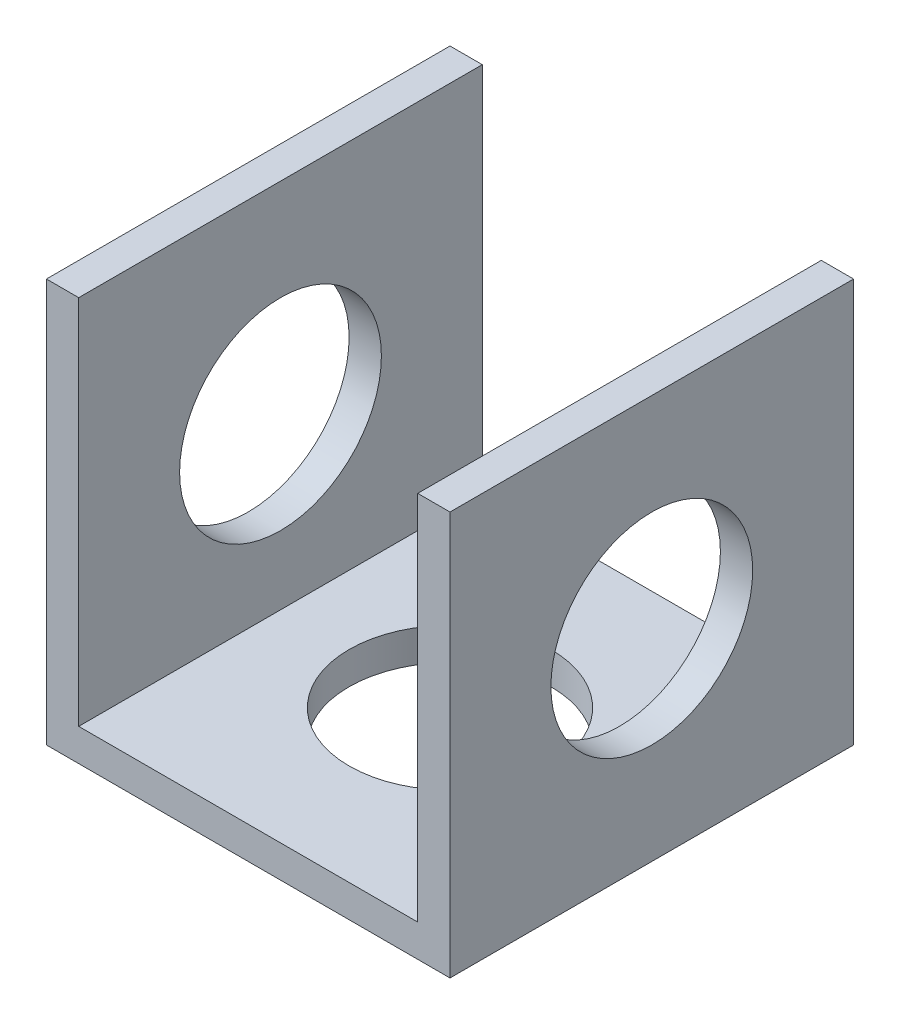
ISO-10303-21;
HEADER;
FILE_DESCRIPTION(('STEP AP214'),'2;1');
FILE_NAME('part.step','',(''),(''),'','','');
FILE_SCHEMA(('AUTOMOTIVE_DESIGN { 1 0 10303 214 1 1 1 1 }'));
ENDSEC;
DATA;
#1=APPLICATION_CONTEXT('core data for automotive mechanical design processes');
#2=APPLICATION_PROTOCOL_DEFINITION('international standard','automotive_design',2000,#1);
#3=PRODUCT_CONTEXT('',#1,'mechanical');
#4=PRODUCT('Part','Part','',(#3));
#5=PRODUCT_RELATED_PRODUCT_CATEGORY('part','',(#4));
#6=PRODUCT_DEFINITION_FORMATION('','',#4);
#7=PRODUCT_DEFINITION_CONTEXT('part definition',#1,'design');
#8=PRODUCT_DEFINITION('design','',#6,#7);
#9=PRODUCT_DEFINITION_SHAPE('','',#8);
#10=(LENGTH_UNIT() NAMED_UNIT(*) SI_UNIT(.MILLI.,.METRE.));
#11=(NAMED_UNIT(*) PLANE_ANGLE_UNIT() SI_UNIT($,.RADIAN.));
#12=(NAMED_UNIT(*) SI_UNIT($,.STERADIAN.) SOLID_ANGLE_UNIT());
#13=UNCERTAINTY_MEASURE_WITH_UNIT(LENGTH_MEASURE(1.E-05),#10,'distance_accuracy_value','');
#14=(GEOMETRIC_REPRESENTATION_CONTEXT(3) GLOBAL_UNCERTAINTY_ASSIGNED_CONTEXT((#13)) GLOBAL_UNIT_ASSIGNED_CONTEXT((#10,
#11,#12)) REPRESENTATION_CONTEXT('',''));
#15=CARTESIAN_POINT('',(0.,0.,0.));
#16=DIRECTION('',(0.,0.,1.));
#17=DIRECTION('',(1.,0.,0.));
#18=AXIS2_PLACEMENT_3D('',#15,#16,#17);
#19=CARTESIAN_POINT('',(6.35,6.35,0.));
#20=DIRECTION('',(0.,-1.,0.));
#21=DIRECTION('',(0.,0.,-1.));
#22=AXIS2_PLACEMENT_3D('',#19,#20,#21);
#23=PLANE('',#22);
#24=DIRECTION('',(-1.,0.,0.));
#25=VECTOR('',#24,1.);
#26=CARTESIAN_POINT('',(6.35,6.35,-6.35));
#27=LINE('',#26,#25);
#28=CARTESIAN_POINT('',(6.35,6.35,-6.35));
#29=VERTEX_POINT('',#28);
#30=CARTESIAN_POINT('',(5.842,6.35,-6.35));
#31=VERTEX_POINT('',#30);
#32=EDGE_CURVE('E171',#29,#31,#27,.T.);
#33=ORIENTED_EDGE('',*,*,#32,.T.);
#34=DIRECTION('',(0.,0.,-1.));
#35=VECTOR('',#34,1.);
#36=CARTESIAN_POINT('',(5.842,6.35,0.));
#37=LINE('',#36,#35);
#38=CARTESIAN_POINT('',(5.842,6.35,0.));
#39=VERTEX_POINT('',#38);
#40=EDGE_CURVE('E142',#39,#31,#37,.T.);
#41=ORIENTED_EDGE('',*,*,#40,.F.);
#42=DIRECTION('',(-1.,0.,0.));
#43=VECTOR('',#42,1.);
#44=CARTESIAN_POINT('',(6.35,6.35,0.));
#45=LINE('',#44,#43);
#46=CARTESIAN_POINT('',(6.35,6.35,0.));
#47=VERTEX_POINT('',#46);
#48=EDGE_CURVE('E131',#47,#39,#45,.T.);
#49=ORIENTED_EDGE('',*,*,#48,.F.);
#50=DIRECTION('',(0.,0.,1.));
#51=VECTOR('',#50,1.);
#52=CARTESIAN_POINT('',(6.35,6.35,0.));
#53=LINE('',#52,#51);
#54=EDGE_CURVE('E59',#29,#47,#53,.T.);
#55=ORIENTED_EDGE('',*,*,#54,.F.);
#56=EDGE_LOOP('',(#33,#41,#49,#55));
#57=FACE_BOUND('',#56,.T.);
#58=ADVANCED_FACE('F33',(#57),#23,.F.);
#59=CARTESIAN_POINT('',(6.35,3.175,-3.175));
#60=DIRECTION('',(1.,0.,0.));
#61=DIRECTION('',(0.,0.,-1.));
#62=AXIS2_PLACEMENT_3D('',#59,#60,#61);
#63=CYLINDRICAL_SURFACE('',#62,1.58749999999999);
#64=CARTESIAN_POINT('',(5.842,3.175,-3.175));
#65=DIRECTION('',(1.,0.,0.));
#66=DIRECTION('',(0.,1.,0.));
#67=AXIS2_PLACEMENT_3D('',#64,#65,#66);
#68=CIRCLE('',#67,1.58749999999999);
#69=CARTESIAN_POINT('',(5.842,4.76249999999999,-3.175));
#70=VERTEX_POINT('',#69);
#71=EDGE_CURVE('E37',#70,#70,#68,.F.);
#72=ORIENTED_EDGE('',*,*,#71,.T.);
#73=EDGE_LOOP('',(#72));
#74=FACE_BOUND('',#73,.T.);
#75=CARTESIAN_POINT('',(6.35,3.175,-3.175));
#76=DIRECTION('',(1.,0.,0.));
#77=DIRECTION('',(0.,0.,-1.));
#78=AXIS2_PLACEMENT_3D('',#75,#76,#77);
#79=CIRCLE('',#78,1.58749999999999);
#80=CARTESIAN_POINT('',(6.35,3.175,-4.76249999999999));
#81=VERTEX_POINT('',#80);
#82=EDGE_CURVE('E148',#81,#81,#79,.T.);
#83=ORIENTED_EDGE('',*,*,#82,.T.);
#84=EDGE_LOOP('',(#83));
#85=FACE_BOUND('',#84,.T.);
#86=ADVANCED_FACE('F181',(#74,#85),#63,.F.);
#87=CARTESIAN_POINT('',(6.35,0.,0.));
#88=DIRECTION('',(0.,0.,-1.));
#89=DIRECTION('',(0.,1.,0.));
#90=AXIS2_PLACEMENT_3D('',#87,#88,#89);
#91=PLANE('',#90);
#92=ORIENTED_EDGE('',*,*,#48,.T.);
#93=DIRECTION('',(0.,-1.,0.));
#94=VECTOR('',#93,1.);
#95=CARTESIAN_POINT('',(5.842,6.35,0.));
#96=LINE('',#95,#94);
#97=CARTESIAN_POINT('',(5.842,0.508,0.));
#98=VERTEX_POINT('',#97);
#99=EDGE_CURVE('E114',#39,#98,#96,.T.);
#100=ORIENTED_EDGE('',*,*,#99,.T.);
#101=DIRECTION('',(-1.,0.,0.));
#102=VECTOR('',#101,1.);
#103=CARTESIAN_POINT('',(5.842,0.508,0.));
#104=LINE('',#103,#102);
#105=CARTESIAN_POINT('',(0.507999999999999,0.508,0.));
#106=VERTEX_POINT('',#105);
#107=EDGE_CURVE('E125',#98,#106,#104,.T.);
#108=ORIENTED_EDGE('',*,*,#107,.T.);
#109=DIRECTION('',(0.,1.,0.));
#110=VECTOR('',#109,1.);
#111=CARTESIAN_POINT('',(0.508,6.35,0.));
#112=LINE('',#111,#110);
#113=CARTESIAN_POINT('',(0.508,6.35,0.));
#114=VERTEX_POINT('',#113);
#115=EDGE_CURVE('E122',#106,#114,#112,.T.);
#116=ORIENTED_EDGE('',*,*,#115,.T.);
#117=CARTESIAN_POINT('',(0.,6.35,0.));
#118=VERTEX_POINT('',#117);
#119=EDGE_CURVE('E81',#114,#118,#45,.T.);
#120=ORIENTED_EDGE('',*,*,#119,.T.);
#121=DIRECTION('',(0.,-1.,0.));
#122=VECTOR('',#121,1.);
#123=CARTESIAN_POINT('',(0.,0.,0.));
#124=LINE('',#123,#122);
#125=CARTESIAN_POINT('',(0.,0.,0.));
#126=VERTEX_POINT('',#125);
#127=EDGE_CURVE('E154',#118,#126,#124,.T.);
#128=ORIENTED_EDGE('',*,*,#127,.T.);
#129=DIRECTION('',(-1.,0.,0.));
#130=VECTOR('',#129,1.);
#131=CARTESIAN_POINT('',(6.35,0.,0.));
#132=LINE('',#131,#130);
#133=CARTESIAN_POINT('',(6.35,0.,0.));
#134=VERTEX_POINT('',#133);
#135=EDGE_CURVE('E11',#134,#126,#132,.T.);
#136=ORIENTED_EDGE('',*,*,#135,.F.);
#137=DIRECTION('',(0.,-1.,0.));
#138=VECTOR('',#137,1.);
#139=CARTESIAN_POINT('',(6.35,0.,0.));
#140=LINE('',#139,#138);
#141=EDGE_CURVE('E155',#47,#134,#140,.T.);
#142=ORIENTED_EDGE('',*,*,#141,.F.);
#143=EDGE_LOOP('',(#92,#100,#108,#116,#120,#128,#136,#142));
#144=FACE_BOUND('',#143,.T.);
#145=ADVANCED_FACE('F35',(#144),#91,.F.);
#146=CARTESIAN_POINT('',(6.35,0.,0.));
#147=DIRECTION('',(0.,1.,0.));
#148=DIRECTION('',(0.,0.,1.));
#149=AXIS2_PLACEMENT_3D('',#146,#147,#148);
#150=PLANE('',#149);
#151=CARTESIAN_POINT('',(3.175,0.,-3.175));
#152=DIRECTION('',(0.,-1.,0.));
#153=DIRECTION('',(0.,0.,-1.));
#154=AXIS2_PLACEMENT_3D('',#151,#152,#153);
#155=CIRCLE('',#154,1.58749999999999);
#156=CARTESIAN_POINT('',(3.175,0.,-4.76249999999999));
#157=VERTEX_POINT('',#156);
#158=EDGE_CURVE('E235',#157,#157,#155,.T.);
#159=ORIENTED_EDGE('',*,*,#158,.F.);
#160=EDGE_LOOP('',(#159));
#161=FACE_BOUND('',#160,.T.);
#162=DIRECTION('',(0.,0.,-1.));
#163=VECTOR('',#162,1.);
#164=CARTESIAN_POINT('',(0.,0.,0.));
#165=LINE('',#164,#163);
#166=CARTESIAN_POINT('',(0.,0.,-6.35));
#167=VERTEX_POINT('',#166);
#168=EDGE_CURVE('E163',#126,#167,#165,.T.);
#169=ORIENTED_EDGE('',*,*,#168,.T.);
#170=DIRECTION('',(-1.,0.,0.));
#171=VECTOR('',#170,1.);
#172=CARTESIAN_POINT('',(6.35,0.,-6.35));
#173=LINE('',#172,#171);
#174=CARTESIAN_POINT('',(6.35,0.,-6.35));
#175=VERTEX_POINT('',#174);
#176=EDGE_CURVE('E42',#175,#167,#173,.T.);
#177=ORIENTED_EDGE('',*,*,#176,.F.);
#178=DIRECTION('',(0.,0.,-1.));
#179=VECTOR('',#178,1.);
#180=CARTESIAN_POINT('',(6.35,0.,0.));
#181=LINE('',#180,#179);
#182=EDGE_CURVE('E88',#134,#175,#181,.T.);
#183=ORIENTED_EDGE('',*,*,#182,.F.);
#184=ORIENTED_EDGE('',*,*,#135,.T.);
#185=EDGE_LOOP('',(#169,#177,#183,#184));
#186=FACE_BOUND('',#185,.T.);
#187=ADVANCED_FACE('F216',(#161,#186),#150,.F.);
#188=CARTESIAN_POINT('',(6.35,0.,-6.35));
#189=DIRECTION('',(0.,0.,1.));
#190=DIRECTION('',(1.,0.,0.));
#191=AXIS2_PLACEMENT_3D('',#188,#189,#190);
#192=PLANE('',#191);
#193=DIRECTION('',(-1.,0.,0.));
#194=VECTOR('',#193,1.);
#195=CARTESIAN_POINT('',(5.842,0.508,-6.35));
#196=LINE('',#195,#194);
#197=CARTESIAN_POINT('',(5.842,0.508,-6.35));
#198=VERTEX_POINT('',#197);
#199=CARTESIAN_POINT('',(0.507999999999999,0.508,-6.35));
#200=VERTEX_POINT('',#199);
#201=EDGE_CURVE('E133',#198,#200,#196,.T.);
#202=ORIENTED_EDGE('',*,*,#201,.F.);
#203=DIRECTION('',(0.,-1.,0.));
#204=VECTOR('',#203,1.);
#205=CARTESIAN_POINT('',(5.842,6.35,-6.35));
#206=LINE('',#205,#204);
#207=EDGE_CURVE('E117',#31,#198,#206,.T.);
#208=ORIENTED_EDGE('',*,*,#207,.F.);
#209=ORIENTED_EDGE('',*,*,#32,.F.);
#210=DIRECTION('',(0.,1.,0.));
#211=VECTOR('',#210,1.);
#212=CARTESIAN_POINT('',(6.35,0.,-6.35));
#213=LINE('',#212,#211);
#214=EDGE_CURVE('E159',#175,#29,#213,.T.);
#215=ORIENTED_EDGE('',*,*,#214,.F.);
#216=ORIENTED_EDGE('',*,*,#176,.T.);
#217=DIRECTION('',(0.,1.,0.));
#218=VECTOR('',#217,1.);
#219=CARTESIAN_POINT('',(0.,0.,-6.35));
#220=LINE('',#219,#218);
#221=CARTESIAN_POINT('',(0.,6.35,-6.35));
#222=VERTEX_POINT('',#221);
#223=EDGE_CURVE('E165',#167,#222,#220,.T.);
#224=ORIENTED_EDGE('',*,*,#223,.T.);
#225=CARTESIAN_POINT('',(0.507999999999999,6.35,-6.35));
#226=VERTEX_POINT('',#225);
#227=EDGE_CURVE('E170',#226,#222,#27,.T.);
#228=ORIENTED_EDGE('',*,*,#227,.F.);
#229=DIRECTION('',(0.,1.,0.));
#230=VECTOR('',#229,1.);
#231=CARTESIAN_POINT('',(0.508,6.35,-6.35));
#232=LINE('',#231,#230);
#233=EDGE_CURVE('E50',#200,#226,#232,.T.);
#234=ORIENTED_EDGE('',*,*,#233,.F.);
#235=EDGE_LOOP('',(#202,#208,#209,#215,#216,#224,#228,#234));
#236=FACE_BOUND('',#235,.T.);
#237=ADVANCED_FACE('F208',(#236),#192,.F.);
#238=ORIENTED_EDGE('',*,*,#119,.F.);
#239=DIRECTION('',(0.,0.,-1.));
#240=VECTOR('',#239,1.);
#241=CARTESIAN_POINT('',(0.508,6.35,0.));
#242=LINE('',#241,#240);
#243=EDGE_CURVE('E145',#114,#226,#242,.T.);
#244=ORIENTED_EDGE('',*,*,#243,.T.);
#245=ORIENTED_EDGE('',*,*,#227,.T.);
#246=DIRECTION('',(0.,0.,1.));
#247=VECTOR('',#246,1.);
#248=CARTESIAN_POINT('',(0.,6.35,0.));
#249=LINE('',#248,#247);
#250=EDGE_CURVE('E157',#222,#118,#249,.T.);
#251=ORIENTED_EDGE('',*,*,#250,.T.);
#252=EDGE_LOOP('',(#238,#244,#245,#251));
#253=FACE_BOUND('',#252,.T.);
#254=ADVANCED_FACE('F199',(#253),#23,.F.);
#255=CARTESIAN_POINT('',(6.35,0.,0.));
#256=DIRECTION('',(-1.,0.,0.));
#257=DIRECTION('',(0.,0.,1.));
#258=AXIS2_PLACEMENT_3D('',#255,#256,#257);
#259=PLANE('',#258);
#260=ORIENTED_EDGE('',*,*,#82,.F.);
#261=EDGE_LOOP('',(#260));
#262=FACE_BOUND('',#261,.T.);
#263=ORIENTED_EDGE('',*,*,#141,.T.);
#264=ORIENTED_EDGE('',*,*,#182,.T.);
#265=ORIENTED_EDGE('',*,*,#214,.T.);
#266=ORIENTED_EDGE('',*,*,#54,.T.);
#267=EDGE_LOOP('',(#263,#264,#265,#266));
#268=FACE_BOUND('',#267,.T.);
#269=ADVANCED_FACE('F207',(#262,#268),#259,.F.);
#270=CARTESIAN_POINT('',(0.,0.,0.));
#271=DIRECTION('',(-1.,0.,0.));
#272=DIRECTION('',(0.,0.,1.));
#273=AXIS2_PLACEMENT_3D('',#270,#271,#272);
#274=PLANE('',#273);
#275=CARTESIAN_POINT('',(0.,3.175,-3.175));
#276=DIRECTION('',(-1.,0.,0.));
#277=DIRECTION('',(0.,0.,1.));
#278=AXIS2_PLACEMENT_3D('',#275,#276,#277);
#279=CIRCLE('',#278,1.58749999999999);
#280=CARTESIAN_POINT('',(0.,3.175,-1.58750000000002));
#281=VERTEX_POINT('',#280);
#282=EDGE_CURVE('E151',#281,#281,#279,.T.);
#283=ORIENTED_EDGE('',*,*,#282,.F.);
#284=EDGE_LOOP('',(#283));
#285=FACE_BOUND('',#284,.T.);
#286=ORIENTED_EDGE('',*,*,#127,.F.);
#287=ORIENTED_EDGE('',*,*,#250,.F.);
#288=ORIENTED_EDGE('',*,*,#223,.F.);
#289=ORIENTED_EDGE('',*,*,#168,.F.);
#290=EDGE_LOOP('',(#286,#287,#288,#289));
#291=FACE_BOUND('',#290,.T.);
#292=ADVANCED_FACE('F193',(#285,#291),#274,.T.);
#293=CARTESIAN_POINT('',(0.507999999999999,3.175,-3.175));
#294=DIRECTION('',(-1.,0.,0.));
#295=DIRECTION('',(0.,-1.,0.));
#296=AXIS2_PLACEMENT_3D('',#293,#294,#295);
#297=CIRCLE('',#296,1.58749999999999);
#298=CARTESIAN_POINT('',(0.507999999999999,1.58750000000002,-3.175));
#299=VERTEX_POINT('',#298);
#300=EDGE_CURVE('E144',#299,#299,#297,.F.);
#301=ORIENTED_EDGE('',*,*,#300,.T.);
#302=EDGE_LOOP('',(#301));
#303=FACE_BOUND('',#302,.T.);
#304=ORIENTED_EDGE('',*,*,#282,.T.);
#305=EDGE_LOOP('',(#304));
#306=FACE_BOUND('',#305,.T.);
#307=ADVANCED_FACE('F185',(#303,#306),#63,.F.);
#308=CARTESIAN_POINT('',(5.842,6.35,0.));
#309=DIRECTION('',(1.,0.,0.));
#310=DIRECTION('',(0.,1.,0.));
#311=AXIS2_PLACEMENT_3D('',#308,#309,#310);
#312=PLANE('',#311);
#313=ORIENTED_EDGE('',*,*,#207,.T.);
#314=DIRECTION('',(0.,0.,-1.));
#315=VECTOR('',#314,1.);
#316=CARTESIAN_POINT('',(5.842,0.508,0.));
#317=LINE('',#316,#315);
#318=EDGE_CURVE('E109',#98,#198,#317,.T.);
#319=ORIENTED_EDGE('',*,*,#318,.F.);
#320=ORIENTED_EDGE('',*,*,#99,.F.);
#321=ORIENTED_EDGE('',*,*,#40,.T.);
#322=EDGE_LOOP('',(#313,#319,#320,#321));
#323=FACE_BOUND('',#322,.T.);
#324=ORIENTED_EDGE('',*,*,#71,.F.);
#325=EDGE_LOOP('',(#324));
#326=FACE_BOUND('',#325,.T.);
#327=ADVANCED_FACE('F111',(#323,#326),#312,.F.);
#328=CARTESIAN_POINT('',(0.508,6.35,0.));
#329=DIRECTION('',(-1.,0.,0.));
#330=DIRECTION('',(0.,-1.,0.));
#331=AXIS2_PLACEMENT_3D('',#328,#329,#330);
#332=PLANE('',#331);
#333=ORIENTED_EDGE('',*,*,#233,.T.);
#334=ORIENTED_EDGE('',*,*,#243,.F.);
#335=ORIENTED_EDGE('',*,*,#115,.F.);
#336=DIRECTION('',(0.,0.,-1.));
#337=VECTOR('',#336,1.);
#338=CARTESIAN_POINT('',(0.507999999999999,0.508,0.));
#339=LINE('',#338,#337);
#340=EDGE_CURVE('E121',#106,#200,#339,.T.);
#341=ORIENTED_EDGE('',*,*,#340,.T.);
#342=EDGE_LOOP('',(#333,#334,#335,#341));
#343=FACE_BOUND('',#342,.T.);
#344=ORIENTED_EDGE('',*,*,#300,.F.);
#345=EDGE_LOOP('',(#344));
#346=FACE_BOUND('',#345,.T.);
#347=ADVANCED_FACE('F184',(#343,#346),#332,.F.);
#348=CARTESIAN_POINT('',(5.842,0.508,0.));
#349=DIRECTION('',(0.,-1.,0.));
#350=DIRECTION('',(0.,0.,-1.));
#351=AXIS2_PLACEMENT_3D('',#348,#349,#350);
#352=PLANE('',#351);
#353=CARTESIAN_POINT('',(3.175,0.508,-3.175));
#354=DIRECTION('',(0.,-1.,0.));
#355=DIRECTION('',(0.,0.,-1.));
#356=AXIS2_PLACEMENT_3D('',#353,#354,#355);
#357=CIRCLE('',#356,1.58749999999999);
#358=CARTESIAN_POINT('',(3.175,0.508,-4.76249999999999));
#359=VERTEX_POINT('',#358);
#360=EDGE_CURVE('E136',#359,#359,#357,.T.);
#361=ORIENTED_EDGE('',*,*,#360,.T.);
#362=EDGE_LOOP('',(#361));
#363=FACE_BOUND('',#362,.T.);
#364=ORIENTED_EDGE('',*,*,#201,.T.);
#365=ORIENTED_EDGE('',*,*,#340,.F.);
#366=ORIENTED_EDGE('',*,*,#107,.F.);
#367=ORIENTED_EDGE('',*,*,#318,.T.);
#368=EDGE_LOOP('',(#364,#365,#366,#367));
#369=FACE_BOUND('',#368,.T.);
#370=ADVANCED_FACE('F126',(#363,#369),#352,.F.);
#371=CARTESIAN_POINT('',(3.175,0.,-3.175));
#372=DIRECTION('',(0.,-1.,0.));
#373=DIRECTION('',(0.,0.,-1.));
#374=AXIS2_PLACEMENT_3D('',#371,#372,#373);
#375=CYLINDRICAL_SURFACE('',#374,1.58749999999999);
#376=ORIENTED_EDGE('',*,*,#158,.T.);
#377=EDGE_LOOP('',(#376));
#378=FACE_BOUND('',#377,.T.);
#379=ORIENTED_EDGE('',*,*,#360,.F.);
#380=EDGE_LOOP('',(#379));
#381=FACE_BOUND('',#380,.T.);
#382=ADVANCED_FACE('F241',(#378,#381),#375,.F.);
#383=CLOSED_SHELL('',(#58,#86,#145,#187,#237,#254,#269,#292,#307,#327,#347,#370,#382));
#384=MANIFOLD_SOLID_BREP('B2',#383);
#385=ADVANCED_BREP_SHAPE_REPRESENTATION('',(#18,#384),#14);
#386=SHAPE_DEFINITION_REPRESENTATION(#9,#385);
ENDSEC;
END-ISO-10303-21;
